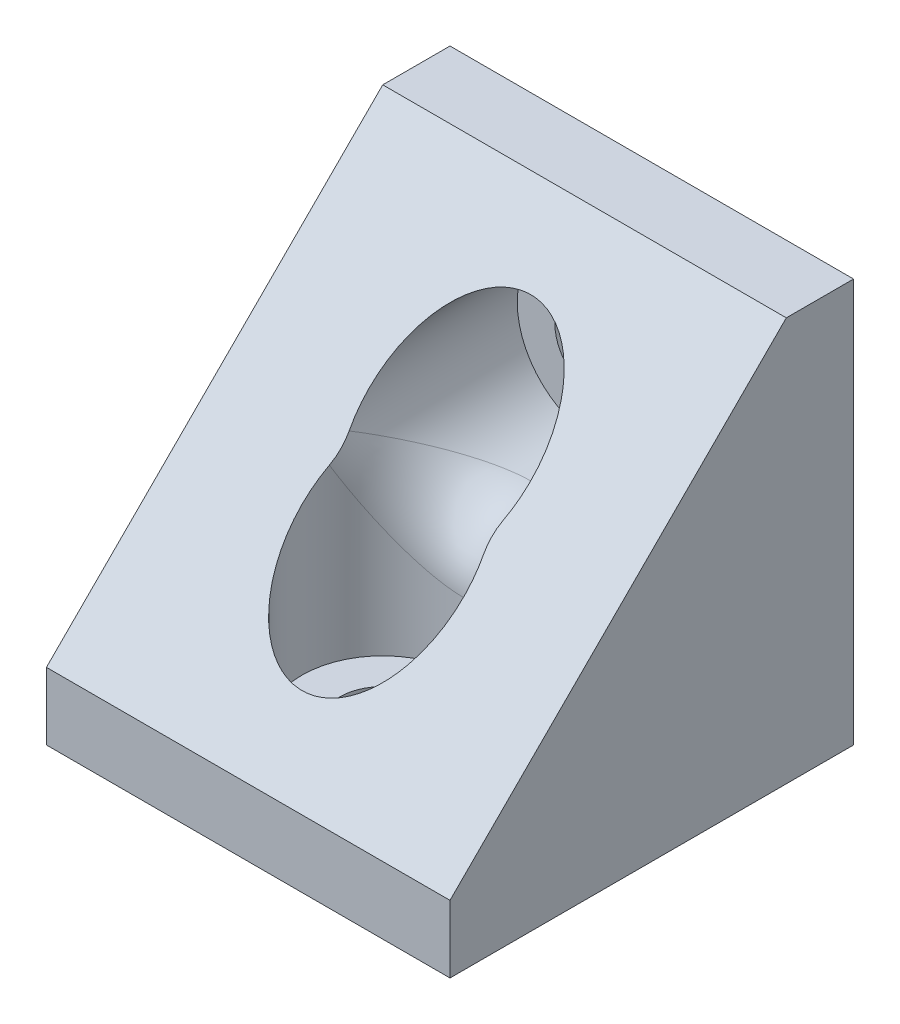
ISO-10303-21;
HEADER;
FILE_DESCRIPTION(('STEP AP214'),'2;1');
FILE_NAME('part.step','',(''),(''),'','','');
FILE_SCHEMA(('AUTOMOTIVE_DESIGN { 1 0 10303 214 1 1 1 1 }'));
ENDSEC;
DATA;
#1=APPLICATION_CONTEXT('core data for automotive mechanical design processes');
#2=APPLICATION_PROTOCOL_DEFINITION('international standard','automotive_design',2000,#1);
#3=PRODUCT_CONTEXT('',#1,'mechanical');
#4=PRODUCT('Part','Part','',(#3));
#5=PRODUCT_RELATED_PRODUCT_CATEGORY('part','',(#4));
#6=PRODUCT_DEFINITION_FORMATION('','',#4);
#7=PRODUCT_DEFINITION_CONTEXT('part definition',#1,'design');
#8=PRODUCT_DEFINITION('design','',#6,#7);
#9=PRODUCT_DEFINITION_SHAPE('','',#8);
#10=(LENGTH_UNIT() NAMED_UNIT(*) SI_UNIT(.MILLI.,.METRE.));
#11=(NAMED_UNIT(*) PLANE_ANGLE_UNIT() SI_UNIT($,.RADIAN.));
#12=(NAMED_UNIT(*) SI_UNIT($,.STERADIAN.) SOLID_ANGLE_UNIT());
#13=UNCERTAINTY_MEASURE_WITH_UNIT(LENGTH_MEASURE(1.E-05),#10,'distance_accuracy_value','');
#14=(GEOMETRIC_REPRESENTATION_CONTEXT(3) GLOBAL_UNCERTAINTY_ASSIGNED_CONTEXT((#13)) GLOBAL_UNIT_ASSIGNED_CONTEXT((#10,
#11,#12)) REPRESENTATION_CONTEXT('',''));
#15=CARTESIAN_POINT('',(0.,0.,0.));
#16=DIRECTION('',(0.,0.,1.));
#17=DIRECTION('',(1.,0.,0.));
#18=AXIS2_PLACEMENT_3D('',#15,#16,#17);
#19=CARTESIAN_POINT('',(30.,30.,5.));
#20=DIRECTION('',(0.,-0.707106781186551,-0.707106781186544));
#21=DIRECTION('',(0.,0.707106781186544,-0.707106781186551));
#22=AXIS2_PLACEMENT_3D('',#19,#20,#21);
#23=PLANE('',#22);
#24=CARTESIAN_POINT('',(15.,15.0000000000003,19.9999999999998));
#25=DIRECTION('',(0.,0.707106781186551,0.707106781186544));
#26=DIRECTION('',(0.,-0.707106781186544,0.707106781186551));
#27=AXIS2_PLACEMENT_3D('',#24,#25,#26);
#28=ELLIPSE('',#27,8.48528137423861,6.);
#29=CARTESIAN_POINT('',(9.26538465555105,16.7647058823531,18.235294117647));
#30=VERTEX_POINT('',#29);
#31=CARTESIAN_POINT('',(20.7346153444489,16.7647058823531,18.235294117647));
#32=VERTEX_POINT('',#31);
#33=EDGE_CURVE('E235',#30,#32,#28,.T.);
#34=ORIENTED_EDGE('',*,*,#33,.F.);
#35=CARTESIAN_POINT('',(9.,20.,19.9999999999998));
#36=CARTESIAN_POINT('',(9.,20.,19.9999999999998));
#37=CARTESIAN_POINT('',(9.,20.,19.9999999999998));
#38=CARTESIAN_POINT('',(9.00000752853285,19.7603458974245,19.8692795804132));
#39=CARTESIAN_POINT('',(8.9999754753644,19.8148130985904,19.8148130985902));
#40=CARTESIAN_POINT('',(9.00000752853285,19.8692795804134,19.7603458974243));
#41=CARTESIAN_POINT('',(9.0042718387287,19.5207263616738,19.7385780154582));
#42=CARTESIAN_POINT('',(9.0078397715869,19.6295210965094,19.6295210965092));
#43=CARTESIAN_POINT('',(9.0042718387287,19.7385780154584,19.5207263616736));
#44=CARTESIAN_POINT('',(9.02136473344592,19.0419818103791,19.4774446238429));
#45=CARTESIAN_POINT('',(9.03916005140826,19.2602799073418,19.2602799073416));
#46=CARTESIAN_POINT('',(9.02136473344592,19.4774446238431,19.0419818103789));
#47=CARTESIAN_POINT('',(9.03419403239813,18.8028568377572,19.3470128205946));
#48=CARTESIAN_POINT('',(9.06266192213282,19.0760694895224,19.0760694895222));
#49=CARTESIAN_POINT('',(9.03419403239813,19.3470128205948,18.802856837757));
#50=CARTESIAN_POINT('',(9.08530255167739,18.0911259080916,18.9587959498679));
#51=CARTESIAN_POINT('',(9.1561561210999,18.5295256460378,18.5295256460376));
#52=CARTESIAN_POINT('',(9.08530255167739,18.9587959498681,18.0911259080914));
#53=CARTESIAN_POINT('',(9.13620208928388,17.6199263375209,18.701778002284));
#54=CARTESIAN_POINT('',(9.24943775726386,18.1700091496064,18.1700091496063));
#55=CARTESIAN_POINT('',(9.13620208928388,18.7017780022841,17.6199263375207));
#56=CARTESIAN_POINT('',(9.27154335930745,16.6938865636785,18.1966653983699));
#57=CARTESIAN_POINT('',(9.49349892693703,17.4768690772972,17.476869077297));
#58=CARTESIAN_POINT('',(9.27154335930745,18.1966653983701,16.6938865636783));
#59=CARTESIAN_POINT('',(9.35540817035112,16.2389045290022,17.9484933794556));
#60=CARTESIAN_POINT('',(9.64463442221609,17.1411713378073,17.1411713378071));
#61=CARTESIAN_POINT('',(9.35540817035112,17.9484933794558,16.238904529002));
#62=CARTESIAN_POINT('',(9.55554161490088,15.3531065701528,17.4653308564468));
#63=CARTESIAN_POINT('',(9.99728854867579,16.5070240739603,16.5070240739601));
#64=CARTESIAN_POINT('',(9.55554161490088,17.465330856447,15.3531065701526));
#65=CARTESIAN_POINT('',(9.67096110623925,14.9219714358722,17.2301662377483));
#66=CARTESIAN_POINT('',(10.1993364067397,16.2065668144458,16.2065668144456));
#67=CARTESIAN_POINT('',(9.67096110623925,17.2301662377485,14.9219714358721));
#68=CARTESIAN_POINT('',(9.93250426328793,14.0914599425131,16.7771599686433));
#69=CARTESIAN_POINT('',(10.6431462000127,15.6535562231557,15.6535562231555));
#70=CARTESIAN_POINT('',(9.93250426328793,16.7771599686435,14.0914599425129));
#71=CARTESIAN_POINT('',(10.0775336755101,13.6915095054249,16.5590051847771));
#72=CARTESIAN_POINT('',(10.8855894864916,15.399114121709,15.3991141217089));
#73=CARTESIAN_POINT('',(10.0775336755101,16.5590051847772,13.6915095054248));
#74=CARTESIAN_POINT('',(10.3960581325591,12.9304761854701,16.1438961011654));
#75=CARTESIAN_POINT('',(11.3952765699089,14.9471335327306,14.9471335327305));
#76=CARTESIAN_POINT('',(10.3960581325591,16.1438961011655,12.93047618547));
#77=CARTESIAN_POINT('',(10.5682623163386,12.5684939187966,15.9464512284345));
#78=CARTESIAN_POINT('',(11.6633027073068,14.7478961808847,14.7478961808845));
#79=CARTESIAN_POINT('',(10.5682623163386,15.9464512284346,12.5684939187964));
#80=CARTESIAN_POINT('',(10.9384003765285,11.8899257085608,15.5763231137602));
#81=CARTESIAN_POINT('',(12.2045250227463,14.412227015721,14.4122270157208));
#82=CARTESIAN_POINT('',(10.9384003765285,15.5763231137604,11.8899257085607));
#83=CARTESIAN_POINT('',(11.1349255731258,11.5720627617198,15.402943324574));
#84=CARTESIAN_POINT('',(12.4785118806446,14.2743630290576,14.2743630290575));
#85=CARTESIAN_POINT('',(11.1349255731258,15.4029433245741,11.5720627617196));
#86=CARTESIAN_POINT('',(11.550385554616,10.987600949809,15.0841459726232));
#87=CARTESIAN_POINT('',(13.007901779356,14.0618881651102,14.06188816511));
#88=CARTESIAN_POINT('',(11.550385554616,15.0841459726233,10.9876009498088));
#89=CARTESIAN_POINT('',(11.7679160269278,10.7193400513368,14.9378218461847));
#90=CARTESIAN_POINT('',(13.2639680979251,13.9861731477013,13.9861731477011));
#91=CARTESIAN_POINT('',(11.7679160269278,14.9378218461848,10.7193400513367));
#92=CARTESIAN_POINT('',(12.221834187391,10.2389486354842,14.6757901648084));
#93=CARTESIAN_POINT('',(13.7325365666842,13.890187216388,13.8901872163878));
#94=CARTESIAN_POINT('',(12.221834187391,14.6757901648085,10.238948635484));
#95=CARTESIAN_POINT('',(12.4569647764445,10.0248624037429,14.5590158565831));
#96=CARTESIAN_POINT('',(13.9454397062226,13.8691504952176,13.8691504952174));
#97=CARTESIAN_POINT('',(12.4569647764445,14.5590158565832,10.0248624037427));
#98=CARTESIAN_POINT('',(12.8226386169068,9.74714732275079,14.4075349033203));
#99=CARTESIAN_POINT('',(14.2182953361164,13.8654123996071,13.865412399607));
#100=CARTESIAN_POINT('',(12.8226386169068,14.4075349033204,9.74714732275064));
#101=CARTESIAN_POINT('',(12.9441071514476,9.66310814085734,14.3616953495636));
#102=CARTESIAN_POINT('',(14.3007771201009,13.8686489339747,13.8686489339746));
#103=CARTESIAN_POINT('',(12.9441071514476,14.3616953495637,9.66310814085719));
#104=CARTESIAN_POINT('',(13.1920288957753,9.50853431928578,14.2773823559782));
#105=CARTESIAN_POINT('',(14.4512156982057,13.881156363931,13.8811563639308));
#106=CARTESIAN_POINT('',(13.1920288957753,14.2773823559783,9.50853431928563));
#107=CARTESIAN_POINT('',(13.3184796608175,9.43799315334304,14.2389053563689));
#108=CARTESIAN_POINT('',(14.5188806436997,13.8904877294729,13.8904877294728));
#109=CARTESIAN_POINT('',(13.3184796608175,14.238905356369,9.43799315334289));
#110=CARTESIAN_POINT('',(13.5719049366675,9.31349894951488,14.1709994270079));
#111=CARTESIAN_POINT('',(14.6373358009317,13.9117685026329,13.9117685026327));
#112=CARTESIAN_POINT('',(13.5719049366675,14.170999427008,9.31349894951473));
#113=CARTESIAN_POINT('',(13.6987543885076,9.25911862858065,14.1413374337748));
#114=CARTESIAN_POINT('',(14.6883176176596,13.9236435596809,13.9236435596808));
#115=CARTESIAN_POINT('',(13.6987543885076,14.1413374337749,9.2591186285805));
#116=CARTESIAN_POINT('',(13.9556418837811,9.16525512671252,14.0901391600292));
#117=CARTESIAN_POINT('',(14.7772381709888,13.9470134699862,13.9470134699861));
#118=CARTESIAN_POINT('',(13.9556418837811,14.0901391600293,9.16525512671237));
#119=CARTESIAN_POINT('',(14.0856783519271,9.1257647380193,14.0685989480115));
#120=CARTESIAN_POINT('',(14.8149723647627,13.9584778167434,13.9584778167433));
#121=CARTESIAN_POINT('',(14.0856783519271,14.0685989480116,9.12576473801915));
#122=CARTESIAN_POINT('',(14.3458965753316,9.06295777190634,14.0343406028568));
#123=CARTESIAN_POINT('',(14.879898597683,13.9779960998507,13.9779960998506));
#124=CARTESIAN_POINT('',(14.3458965753316,14.0343406028569,9.06295777190619));
#125=CARTESIAN_POINT('',(14.4760423171523,9.03939114403074,14.0214860785621));
#126=CARTESIAN_POINT('',(14.9071142914436,13.986059689095,13.9860596890949));
#127=CARTESIAN_POINT('',(14.4760423171523,14.0214860785622,9.03939114403059));
#128=CARTESIAN_POINT('',(14.7374587193486,9.00791239729594,14.0043158530709));
#129=CARTESIAN_POINT('',(14.9562655706693,13.9970766274864,13.9970766274862));
#130=CARTESIAN_POINT('',(14.7374587193486,14.004315853071,9.0079123972958));
#131=CARTESIAN_POINT('',(14.8687293596743,9.00000000000006,13.9999999999999));
#132=CARTESIAN_POINT('',(14.9781170220427,14.,13.9999999999999));
#133=CARTESIAN_POINT('',(14.8687293596743,14.,8.99999999999991));
#134=CARTESIAN_POINT('',(15.1312706403257,9.00000000000006,13.9999999999999));
#135=CARTESIAN_POINT('',(15.0218829779573,14.,13.9999999999999));
#136=CARTESIAN_POINT('',(15.1312706403257,14.,8.99999999999991));
#137=CARTESIAN_POINT('',(15.2625412806514,9.00791239729594,14.0043158530709));
#138=CARTESIAN_POINT('',(15.0437344293307,13.9970766274864,13.9970766274862));
#139=CARTESIAN_POINT('',(15.2625412806514,14.004315853071,9.0079123972958));
#140=CARTESIAN_POINT('',(15.5239576828477,9.03939114403074,14.0214860785621));
#141=CARTESIAN_POINT('',(15.0928857085564,13.986059689095,13.9860596890949));
#142=CARTESIAN_POINT('',(15.5239576828477,14.0214860785622,9.03939114403059));
#143=CARTESIAN_POINT('',(15.6541034246684,9.06295777190634,14.0343406028568));
#144=CARTESIAN_POINT('',(15.120101402317,13.9779960998507,13.9779960998506));
#145=CARTESIAN_POINT('',(15.6541034246684,14.0343406028569,9.06295777190619));
#146=CARTESIAN_POINT('',(15.9143216480729,9.1257647380193,14.0685989480115));
#147=CARTESIAN_POINT('',(15.1850276352373,13.9584778167434,13.9584778167433));
#148=CARTESIAN_POINT('',(15.9143216480729,14.0685989480116,9.12576473801915));
#149=CARTESIAN_POINT('',(16.0443581162189,9.16525512671252,14.0901391600292));
#150=CARTESIAN_POINT('',(15.2227618290112,13.9470134699863,13.9470134699861));
#151=CARTESIAN_POINT('',(16.0443581162189,14.0901391600293,9.16525512671237));
#152=CARTESIAN_POINT('',(16.3012456114924,9.25911862858065,14.1413374337748));
#153=CARTESIAN_POINT('',(15.3116823823404,13.9236435596809,13.9236435596808));
#154=CARTESIAN_POINT('',(16.3012456114924,14.1413374337749,9.2591186285805));
#155=CARTESIAN_POINT('',(16.4280950633325,9.31349894951488,14.1709994270079));
#156=CARTESIAN_POINT('',(15.3626641990683,13.9117685026329,13.9117685026327));
#157=CARTESIAN_POINT('',(16.4280950633325,14.170999427008,9.31349894951473));
#158=CARTESIAN_POINT('',(16.6815203391825,9.43799315334304,14.2389053563689));
#159=CARTESIAN_POINT('',(15.4811193563003,13.8904877294729,13.8904877294728));
#160=CARTESIAN_POINT('',(16.6815203391825,14.238905356369,9.43799315334289));
#161=CARTESIAN_POINT('',(16.8079711042247,9.50853431928578,14.2773823559782));
#162=CARTESIAN_POINT('',(15.5487843017943,13.881156363931,13.8811563639308));
#163=CARTESIAN_POINT('',(16.8079711042247,14.2773823559783,9.50853431928563));
#164=CARTESIAN_POINT('',(17.0558928485524,9.66310814085734,14.3616953495636));
#165=CARTESIAN_POINT('',(15.6992228798991,13.8686489339747,13.8686489339746));
#166=CARTESIAN_POINT('',(17.0558928485524,14.3616953495637,9.66310814085719));
#167=CARTESIAN_POINT('',(17.1773613830932,9.74714732275079,14.4075349033203));
#168=CARTESIAN_POINT('',(15.7817046638836,13.8654123996071,13.865412399607));
#169=CARTESIAN_POINT('',(17.1773613830932,14.4075349033204,9.74714732275064));
#170=CARTESIAN_POINT('',(17.5430352235555,10.0248624037429,14.5590158565831));
#171=CARTESIAN_POINT('',(16.0545602937774,13.8691504952176,13.8691504952174));
#172=CARTESIAN_POINT('',(17.5430352235555,14.5590158565832,10.0248624037427));
#173=CARTESIAN_POINT('',(17.778165812609,10.2389486354842,14.6757901648084));
#174=CARTESIAN_POINT('',(16.2674634333158,13.890187216388,13.8901872163878));
#175=CARTESIAN_POINT('',(17.778165812609,14.6757901648085,10.238948635484));
#176=CARTESIAN_POINT('',(18.2320839730722,10.7193400513368,14.9378218461847));
#177=CARTESIAN_POINT('',(16.7360319020749,13.9861731477013,13.9861731477011));
#178=CARTESIAN_POINT('',(18.2320839730722,14.9378218461848,10.7193400513367));
#179=CARTESIAN_POINT('',(18.449614445384,10.987600949809,15.0841459726232));
#180=CARTESIAN_POINT('',(16.992098220644,14.0618881651102,14.06188816511));
#181=CARTESIAN_POINT('',(18.449614445384,15.0841459726233,10.9876009498088));
#182=CARTESIAN_POINT('',(18.8650744268742,11.5720627617198,15.402943324574));
#183=CARTESIAN_POINT('',(17.5214881193554,14.2743630290576,14.2743630290575));
#184=CARTESIAN_POINT('',(18.8650744268742,15.4029433245741,11.5720627617196));
#185=CARTESIAN_POINT('',(19.0615996234715,11.8899257085608,15.5763231137602));
#186=CARTESIAN_POINT('',(17.7954749772537,14.412227015721,14.4122270157208));
#187=CARTESIAN_POINT('',(19.0615996234715,15.5763231137604,11.8899257085607));
#188=CARTESIAN_POINT('',(19.4317376836614,12.5684939187966,15.9464512284345));
#189=CARTESIAN_POINT('',(18.3366972926932,14.7478961808847,14.7478961808845));
#190=CARTESIAN_POINT('',(19.4317376836614,15.9464512284346,12.5684939187964));
#191=CARTESIAN_POINT('',(19.6039418674409,12.9304761854701,16.1438961011654));
#192=CARTESIAN_POINT('',(18.6047234300911,14.9471335327306,14.9471335327305));
#193=CARTESIAN_POINT('',(19.6039418674409,16.1438961011655,12.93047618547));
#194=CARTESIAN_POINT('',(19.9224663244899,13.6915095054249,16.5590051847771));
#195=CARTESIAN_POINT('',(19.1144105135084,15.399114121709,15.3991141217089));
#196=CARTESIAN_POINT('',(19.9224663244899,16.5590051847772,13.6915095054248));
#197=CARTESIAN_POINT('',(20.0674957367121,14.0914599425131,16.7771599686433));
#198=CARTESIAN_POINT('',(19.3568537999873,15.6535562231556,15.6535562231555));
#199=CARTESIAN_POINT('',(20.0674957367121,16.7771599686435,14.0914599425129));
#200=CARTESIAN_POINT('',(20.3290388937607,14.9219714358722,17.2301662377483));
#201=CARTESIAN_POINT('',(19.8006635932603,16.2065668144458,16.2065668144456));
#202=CARTESIAN_POINT('',(20.3290388937607,17.2301662377485,14.9219714358721));
#203=CARTESIAN_POINT('',(20.4444583850991,15.3531065701528,17.4653308564468));
#204=CARTESIAN_POINT('',(20.0027114513242,16.5070240739603,16.5070240739601));
#205=CARTESIAN_POINT('',(20.4444583850991,17.465330856447,15.3531065701526));
#206=CARTESIAN_POINT('',(20.6445918296489,16.2389045290022,17.9484933794556));
#207=CARTESIAN_POINT('',(20.3553655777839,17.1411713378073,17.1411713378071));
#208=CARTESIAN_POINT('',(20.6445918296489,17.9484933794558,16.238904529002));
#209=CARTESIAN_POINT('',(20.7284566406925,16.6938865636785,18.1966653983699));
#210=CARTESIAN_POINT('',(20.506501073063,17.4768690772972,17.476869077297));
#211=CARTESIAN_POINT('',(20.7284566406925,18.1966653983701,16.6938865636783));
#212=CARTESIAN_POINT('',(20.8637979107161,17.6199263375209,18.7017780022839));
#213=CARTESIAN_POINT('',(20.7505622427361,18.1700091496064,18.1700091496063));
#214=CARTESIAN_POINT('',(20.8637979107161,18.7017780022841,17.6199263375207));
#215=CARTESIAN_POINT('',(20.9146974483226,18.0911259080916,18.9587959498679));
#216=CARTESIAN_POINT('',(20.8438438789001,18.5295256460378,18.5295256460376));
#217=CARTESIAN_POINT('',(20.9146974483226,18.9587959498681,18.0911259080914));
#218=CARTESIAN_POINT('',(20.9658059676019,18.8028568377572,19.3470128205946));
#219=CARTESIAN_POINT('',(20.9373380778672,19.0760694895224,19.0760694895222));
#220=CARTESIAN_POINT('',(20.9658059676019,19.3470128205948,18.802856837757));
#221=CARTESIAN_POINT('',(20.9786352665541,19.0419818103791,19.4774446238429));
#222=CARTESIAN_POINT('',(20.9608399485917,19.2602799073418,19.2602799073416));
#223=CARTESIAN_POINT('',(20.9786352665541,19.4774446238431,19.0419818103789));
#224=CARTESIAN_POINT('',(20.9957281612713,19.5207263616738,19.7385780154582));
#225=CARTESIAN_POINT('',(20.9921602284131,19.6295210965094,19.6295210965092));
#226=CARTESIAN_POINT('',(20.9957281612713,19.7385780154584,19.5207263616736));
#227=CARTESIAN_POINT('',(20.9999924714671,19.7603458974245,19.8692795804131));
#228=CARTESIAN_POINT('',(21.0000245246356,19.8148130985904,19.8148130985902));
#229=CARTESIAN_POINT('',(20.9999924714671,19.8692795804134,19.7603458974243));
#230=CARTESIAN_POINT('',(21.,20.,19.9999999999998));
#231=CARTESIAN_POINT('',(21.,20.,19.9999999999998));
#232=CARTESIAN_POINT('',(21.,20.,19.9999999999998));
#233=(BOUNDED_SURFACE() B_SPLINE_SURFACE(3,2,((#35,#36,#37),(#38,#39,#40),(#41,#42,#43),(#44,
#45,#46),(#47,#48,#49),(#50,#51,#52),(#53,#54,#55),(#56,#57,#58),(#59,#60,#61),(#62,#63,#64),
(#65,#66,#67),(#68,#69,#70),(#71,#72,#73),(#74,#75,#76),(#77,#78,#79),(#80,#81,#82),(#83,#84,
#85),(#86,#87,#88),(#89,#90,#91),(#92,#93,#94),(#95,#96,#97),(#98,#99,#100),(#101,#102,#103),
(#104,#105,#106),(#107,#108,#109),(#110,#111,#112),(#113,#114,#115),(#116,#117,#118),(#119,#120,
#121),(#122,#123,#124),(#125,#126,#127),(#128,#129,#130),(#131,#132,#133),(#134,#135,#136),
(#137,#138,#139),(#140,#141,#142),(#143,#144,#145),(#146,#147,#148),(#149,#150,#151),(#152,#153,
#154),(#155,#156,#157),(#158,#159,#160),(#161,#162,#163),(#164,#165,#166),(#167,#168,#169),
(#170,#171,#172),(#173,#174,#175),(#176,#177,#178),(#179,#180,#181),(#182,#183,#184),(#185,#186,
#187),(#188,#189,#190),(#191,#192,#193),(#194,#195,#196),(#197,#198,#199),(#200,#201,#202),
(#203,#204,#205),(#206,#207,#208),(#209,#210,#211),(#212,#213,#214),(#215,#216,#217),(#218,#219,
#220),(#221,#222,#223),(#224,#225,#226),(#227,#228,#229),(#230,#231,#232)),.UNSPECIFIED.,.F.,
.F.,.F.) B_SPLINE_SURFACE_WITH_KNOTS((4,2,2,2,2,2,2,2,2,2,2,2,2,2,2,2,2,2,2,2,2,2,2,2,2,2,2,2,2,
2,2,2,4),(3,3),(0.,1.01657632639328,2.03323745899664,4.04865040321559,6.03025891798372,
7.96305170811304,9.83432357739877,11.6344992219486,13.3579835680867,15.0040006499645,
16.5773228270909,17.3338592213356,18.0900289022861,18.8239328400925,19.5574810600314,
20.279224647026,21.0009553964872,21.7226861459485,22.4444297329431,23.177977952882,
23.9118818906883,24.6680515716389,25.4245879658835,26.9979101430099,28.6439272248877,
30.3674115710258,32.1675872155757,34.0388590848614,35.9716518749907,37.9532603897589,
39.9686733339778,40.9853344665812,42.0019107929745),(0.,1.),
.UNSPECIFIED.) GEOMETRIC_REPRESENTATION_ITEM() RATIONAL_B_SPLINE_SURFACE(((1.,1.,1.),(1.,
0.999999961347463,1.),(1.,0.999643922983415,1.),(1.,0.998220838244432,1.),(1.,0.9971537325573,
1.),(1.,0.992912442828984,1.),(1.,0.988698139291651,1.),(1.,0.97761667849139,1.),(1.,
0.970795203041526,1.),(1.,0.954789243872562,1.),(1.,0.945667111065176,1.),(1.,0.925487928481902,
1.),(1.,0.914501709356373,1.),(1.,0.891170043426545,1.),(1.,0.878892097179546,1.),(1.,
0.853706858802365,1.),(1.,0.840848661884108,1.),(1.,0.815387916749465,1.),(1.,0.802799855389337,
1.),(1.,0.778879121395581,1.),(1.,0.767515558252509,1.),(1.,0.752114039788178,1.),(1.,
0.747335652878589,1.),(1.,0.738380806528768,1.),(1.,0.734204056441027,1.),(1.,0.726720755902303,
1.),(1.,0.723392203429009,1.),(1.,0.717584783984876,1.),(1.,0.715105505959659,1.),(1.,
0.711136412340241,1.),(1.,0.709631315866732,1.),(1.,0.707616509142034,1.),(1.,0.707106781186551,
1.),(1.,0.707106781186551,1.),(1.,0.707616509142034,1.),(1.,0.709631315866732,1.),(1.,
0.711136412340241,1.),(1.,0.715105505959659,1.),(1.,0.717584783984876,1.),(1.,0.723392203429009,
1.),(1.,0.726720755902303,1.),(1.,0.734204056441027,1.),(1.,0.738380806528768,1.),(1.,
0.747335652878589,1.),(1.,0.752114039788179,1.),(1.,0.76751555825251,1.),(1.,0.778879121395581,
1.),(1.,0.802799855389337,1.),(1.,0.815387916749465,1.),(1.,0.840848661884109,1.),(1.,
0.853706858802365,1.),(1.,0.878892097179546,1.),(1.,0.891170043426545,1.),(1.,0.914501709356372,
1.),(1.,0.925487928481902,1.),(1.,0.945667111065175,1.),(1.,0.954789243872562,1.),(1.,
0.970795203041526,1.),(1.,0.97761667849139,1.),(1.,0.988698139291651,1.),(1.,0.992912442828984,
1.),(1.,0.9971537325573,1.),(1.,0.998220838244432,1.),(1.,0.999643922983415,1.),(1.,
0.999999961347463,1.),(1.,1.,1.))) REPRESENTATION_ITEM('') SURFACE());
#234=CARTESIAN_POINT('',(9.26538465555105,16.7647058823531,18.235294117647));
#235=CARTESIAN_POINT('',(9.2948901609987,16.8605463931236,18.1394536068765));
#236=CARTESIAN_POINT('',(9.31861407894256,16.9572788774362,18.0427211225639));
#237=CARTESIAN_POINT('',(9.3543730986089,17.1518365709526,17.8481634290475));
#238=CARTESIAN_POINT('',(9.36640601121333,17.2496619813372,17.7503380186629));
#239=CARTESIAN_POINT('',(9.37853802304383,17.4439449832289,17.5560550167712));
#240=CARTESIAN_POINT('',(9.37884436545352,17.5403961766117,17.4596038233885));
#241=CARTESIAN_POINT('',(9.368061774075,17.7329601304633,17.2670398695368));
#242=CARTESIAN_POINT('',(9.35697648854989,17.829072989398,17.1709270106022));
#243=CARTESIAN_POINT('',(9.33109589938466,17.9768198366746,17.0231801633255));
#244=CARTESIAN_POINT('',(9.32027620238365,18.0288169286711,16.971183071329));
#245=CARTESIAN_POINT('',(9.29531274658572,18.1323896231641,16.867610376836));
#246=CARTESIAN_POINT('',(9.2811702986511,18.1839653835987,16.8160346164014));
#247=CARTESIAN_POINT('',(9.26538465555105,18.2352941176472,16.764705882353));
#248=B_SPLINE_CURVE_WITH_KNOTS('',3,(#234,#235,#236,#237,#238,#239,#240,#241,#242,#243,#244,
#245,#246,#247),.UNSPECIFIED.,.F.,.F.,(4,2,2,2,2,2,4),(0.,0.416021473667783,0.832120831544366,
1.24086302345128,1.64947435307223,1.87238626166583,2.09521037625455),.UNSPECIFIED.);
#249=CARTESIAN_POINT('',(9.26538465555105,18.2352941176472,16.764705882353));
#250=VERTEX_POINT('',#249);
#251=EDGE_CURVE('E55',#30,#250,#248,.T.);
#252=ORIENTED_EDGE('',*,*,#251,.T.);
#253=CARTESIAN_POINT('',(15.,20.,15.0000000000001));
#254=DIRECTION('',(0.,-0.707106781186551,-0.707106781186544));
#255=DIRECTION('',(0.,0.707106781186544,-0.707106781186551));
#256=AXIS2_PLACEMENT_3D('',#253,#254,#255);
#257=ELLIPSE('',#256,8.48528137423861,6.);
#258=CARTESIAN_POINT('',(20.7346153444489,18.2352941176472,16.764705882353));
#259=VERTEX_POINT('',#258);
#260=EDGE_CURVE('E143',#250,#259,#257,.T.);
#261=ORIENTED_EDGE('',*,*,#260,.T.);
#262=CARTESIAN_POINT('',(20.7346153444489,18.2352941176472,16.764705882353));
#263=CARTESIAN_POINT('',(20.7051098389983,18.1394536068768,16.8605463931233));
#264=CARTESIAN_POINT('',(20.6813859210559,18.0427211225642,16.9572788774359));
#265=CARTESIAN_POINT('',(20.6456269013936,17.8481634290477,17.1518365709524));
#266=CARTESIAN_POINT('',(20.6335939887919,17.7503380186629,17.2496619813372));
#267=CARTESIAN_POINT('',(20.6214619769607,17.5560550167711,17.4439449832291));
#268=CARTESIAN_POINT('',(20.6211556345476,17.4596038233884,17.5403961766118));
#269=CARTESIAN_POINT('',(20.6319382259238,17.2670398695369,17.7329601304633));
#270=CARTESIAN_POINT('',(20.6430235114498,17.1709270106023,17.8290729893979));
#271=CARTESIAN_POINT('',(20.6689041006155,17.0231801633257,17.9768198366744));
#272=CARTESIAN_POINT('',(20.6797237976165,16.9711830713292,18.0288169286709));
#273=CARTESIAN_POINT('',(20.7046872534144,16.8676103768363,18.1323896231638));
#274=CARTESIAN_POINT('',(20.7188297013489,16.8160346164016,18.1839653835985));
#275=CARTESIAN_POINT('',(20.7346153444489,16.7647058823531,18.235294117647));
#276=B_SPLINE_CURVE_WITH_KNOTS('',3,(#262,#263,#264,#265,#266,#267,#268,#269,#270,#271,#272,
#273,#274,#275),.UNSPECIFIED.,.F.,.F.,(4,2,2,2,2,2,4),(0.,0.416021473667478,0.832120831544337,
1.24086302345118,1.64947435307178,1.87238626166528,2.09521037625409),.UNSPECIFIED.);
#277=EDGE_CURVE('E168',#259,#32,#276,.T.);
#278=ORIENTED_EDGE('',*,*,#277,.T.);
#279=EDGE_LOOP('',(#34,#252,#261,#278));
#280=FACE_BOUND('',#279,.T.);
#281=DIRECTION('',(0.,-0.707106781186544,0.707106781186551));
#282=VECTOR('',#281,1.);
#283=CARTESIAN_POINT('',(0.,30.,5.));
#284=LINE('',#283,#282);
#285=CARTESIAN_POINT('',(0.,30.,5.));
#286=VERTEX_POINT('',#285);
#287=CARTESIAN_POINT('',(0.,5.00000000000031,30.));
#288=VERTEX_POINT('',#287);
#289=EDGE_CURVE('E148',#286,#288,#284,.T.);
#290=ORIENTED_EDGE('',*,*,#289,.T.);
#291=DIRECTION('',(-1.,0.,0.));
#292=VECTOR('',#291,1.);
#293=CARTESIAN_POINT('',(30.,5.00000000000031,30.));
#294=LINE('',#293,#292);
#295=CARTESIAN_POINT('',(30.,5.00000000000031,30.));
#296=VERTEX_POINT('',#295);
#297=EDGE_CURVE('E114',#296,#288,#294,.T.);
#298=ORIENTED_EDGE('',*,*,#297,.F.);
#299=DIRECTION('',(0.,-0.707106781186544,0.707106781186551));
#300=VECTOR('',#299,1.);
#301=CARTESIAN_POINT('',(30.,30.,5.));
#302=LINE('',#301,#300);
#303=CARTESIAN_POINT('',(30.,30.,5.));
#304=VERTEX_POINT('',#303);
#305=EDGE_CURVE('E110',#304,#296,#302,.T.);
#306=ORIENTED_EDGE('',*,*,#305,.F.);
#307=DIRECTION('',(-1.,0.,0.));
#308=VECTOR('',#307,1.);
#309=CARTESIAN_POINT('',(30.,30.,5.));
#310=LINE('',#309,#308);
#311=EDGE_CURVE('E155',#304,#286,#310,.T.);
#312=ORIENTED_EDGE('',*,*,#311,.T.);
#313=EDGE_LOOP('',(#290,#298,#306,#312));
#314=FACE_BOUND('',#313,.T.);
#315=ADVANCED_FACE('F41',(#280,#314),#23,.F.);
#316=CARTESIAN_POINT('',(30.,0.,0.));
#317=DIRECTION('',(0.,0.,1.));
#318=DIRECTION('',(1.,0.,0.));
#319=AXIS2_PLACEMENT_3D('',#316,#317,#318);
#320=PLANE('',#319);
#321=CARTESIAN_POINT('',(15.,20.,0.));
#322=DIRECTION('',(0.,0.,-1.));
#323=DIRECTION('',(-1.,0.,0.));
#324=AXIS2_PLACEMENT_3D('',#321,#322,#323);
#325=CIRCLE('',#324,3.2);
#326=CARTESIAN_POINT('',(11.8,20.,0.));
#327=VERTEX_POINT('',#326);
#328=EDGE_CURVE('E145',#327,#327,#325,.T.);
#329=ORIENTED_EDGE('',*,*,#328,.F.);
#330=EDGE_LOOP('',(#329));
#331=FACE_BOUND('',#330,.T.);
#332=DIRECTION('',(0.,1.,0.));
#333=VECTOR('',#332,1.);
#334=CARTESIAN_POINT('',(0.,0.,0.));
#335=LINE('',#334,#333);
#336=CARTESIAN_POINT('',(0.,0.,0.));
#337=VERTEX_POINT('',#336);
#338=CARTESIAN_POINT('',(0.,30.,0.));
#339=VERTEX_POINT('',#338);
#340=EDGE_CURVE('E157',#337,#339,#335,.T.);
#341=ORIENTED_EDGE('',*,*,#340,.T.);
#342=DIRECTION('',(-1.,0.,0.));
#343=VECTOR('',#342,1.);
#344=CARTESIAN_POINT('',(30.,30.,0.));
#345=LINE('',#344,#343);
#346=CARTESIAN_POINT('',(30.,30.,0.));
#347=VERTEX_POINT('',#346);
#348=EDGE_CURVE('E162',#347,#339,#345,.T.);
#349=ORIENTED_EDGE('',*,*,#348,.F.);
#350=DIRECTION('',(0.,1.,0.));
#351=VECTOR('',#350,1.);
#352=CARTESIAN_POINT('',(30.,0.,0.));
#353=LINE('',#352,#351);
#354=CARTESIAN_POINT('',(30.,0.,0.));
#355=VERTEX_POINT('',#354);
#356=EDGE_CURVE('E150',#355,#347,#353,.T.);
#357=ORIENTED_EDGE('',*,*,#356,.F.);
#358=DIRECTION('',(-1.,0.,0.));
#359=VECTOR('',#358,1.);
#360=CARTESIAN_POINT('',(30.,0.,0.));
#361=LINE('',#360,#359);
#362=EDGE_CURVE('E123',#355,#337,#361,.T.);
#363=ORIENTED_EDGE('',*,*,#362,.T.);
#364=EDGE_LOOP('',(#341,#349,#357,#363));
#365=FACE_BOUND('',#364,.T.);
#366=ADVANCED_FACE('F181',(#331,#365),#320,.F.);
#367=CARTESIAN_POINT('',(30.,30.,0.));
#368=DIRECTION('',(0.,-1.,0.));
#369=DIRECTION('',(0.,0.,-1.));
#370=AXIS2_PLACEMENT_3D('',#367,#368,#369);
#371=PLANE('',#370);
#372=DIRECTION('',(0.,0.,1.));
#373=VECTOR('',#372,1.);
#374=CARTESIAN_POINT('',(0.,30.,0.));
#375=LINE('',#374,#373);
#376=EDGE_CURVE('E151',#339,#286,#375,.T.);
#377=ORIENTED_EDGE('',*,*,#376,.T.);
#378=ORIENTED_EDGE('',*,*,#311,.F.);
#379=DIRECTION('',(0.,0.,1.));
#380=VECTOR('',#379,1.);
#381=CARTESIAN_POINT('',(30.,30.,0.));
#382=LINE('',#381,#380);
#383=EDGE_CURVE('E153',#347,#304,#382,.T.);
#384=ORIENTED_EDGE('',*,*,#383,.F.);
#385=ORIENTED_EDGE('',*,*,#348,.T.);
#386=EDGE_LOOP('',(#377,#378,#384,#385));
#387=FACE_BOUND('',#386,.T.);
#388=ADVANCED_FACE('F185',(#387),#371,.F.);
#389=CARTESIAN_POINT('',(30.,0.,0.));
#390=DIRECTION('',(1.,0.,0.));
#391=DIRECTION('',(0.,0.,-1.));
#392=AXIS2_PLACEMENT_3D('',#389,#390,#391);
#393=PLANE('',#392);
#394=ORIENTED_EDGE('',*,*,#305,.T.);
#395=DIRECTION('',(0.,1.,0.));
#396=VECTOR('',#395,1.);
#397=CARTESIAN_POINT('',(30.,3.06421554796543E-13,30.));
#398=LINE('',#397,#396);
#399=CARTESIAN_POINT('',(30.,3.06421554796543E-13,30.));
#400=VERTEX_POINT('',#399);
#401=EDGE_CURVE('E103',#400,#296,#398,.T.);
#402=ORIENTED_EDGE('',*,*,#401,.F.);
#403=DIRECTION('',(0.,0.,1.));
#404=VECTOR('',#403,1.);
#405=CARTESIAN_POINT('',(30.,0.,0.));
#406=LINE('',#405,#404);
#407=EDGE_CURVE('E107',#355,#400,#406,.T.);
#408=ORIENTED_EDGE('',*,*,#407,.F.);
#409=ORIENTED_EDGE('',*,*,#356,.T.);
#410=ORIENTED_EDGE('',*,*,#383,.T.);
#411=EDGE_LOOP('',(#394,#402,#408,#409,#410));
#412=FACE_BOUND('',#411,.T.);
#413=ADVANCED_FACE('F105',(#412),#393,.T.);
#414=CARTESIAN_POINT('',(0.,0.,0.));
#415=DIRECTION('',(1.,0.,0.));
#416=DIRECTION('',(0.,0.,-1.));
#417=AXIS2_PLACEMENT_3D('',#414,#415,#416);
#418=PLANE('',#417);
#419=ORIENTED_EDGE('',*,*,#289,.F.);
#420=ORIENTED_EDGE('',*,*,#376,.F.);
#421=ORIENTED_EDGE('',*,*,#340,.F.);
#422=DIRECTION('',(0.,0.,1.));
#423=VECTOR('',#422,1.);
#424=CARTESIAN_POINT('',(0.,0.,0.));
#425=LINE('',#424,#423);
#426=CARTESIAN_POINT('',(0.,3.06421554796543E-13,30.));
#427=VERTEX_POINT('',#426);
#428=EDGE_CURVE('E128',#337,#427,#425,.T.);
#429=ORIENTED_EDGE('',*,*,#428,.T.);
#430=DIRECTION('',(0.,1.,0.));
#431=VECTOR('',#430,1.);
#432=CARTESIAN_POINT('',(0.,3.06421554796543E-13,30.));
#433=LINE('',#432,#431);
#434=EDGE_CURVE('E120',#427,#288,#433,.T.);
#435=ORIENTED_EDGE('',*,*,#434,.T.);
#436=EDGE_LOOP('',(#419,#420,#421,#429,#435));
#437=FACE_BOUND('',#436,.T.);
#438=ADVANCED_FACE('F190',(#437),#418,.F.);
#439=CARTESIAN_POINT('',(15.,20.,17.5));
#440=DIRECTION('',(0.,0.,-1.));
#441=DIRECTION('',(-1.,0.,0.));
#442=AXIS2_PLACEMENT_3D('',#439,#440,#441);
#443=CYLINDRICAL_SURFACE('',#442,3.2);
#444=CARTESIAN_POINT('',(15.,20.,4.));
#445=DIRECTION('',(0.,0.,-1.));
#446=DIRECTION('',(-1.,0.,0.));
#447=AXIS2_PLACEMENT_3D('',#444,#445,#446);
#448=CIRCLE('',#447,3.2);
#449=CARTESIAN_POINT('',(11.8,20.,4.));
#450=VERTEX_POINT('',#449);
#451=EDGE_CURVE('E140',#450,#450,#448,.T.);
#452=ORIENTED_EDGE('',*,*,#451,.F.);
#453=EDGE_LOOP('',(#452));
#454=FACE_BOUND('',#453,.T.);
#455=ORIENTED_EDGE('',*,*,#328,.T.);
#456=EDGE_LOOP('',(#455));
#457=FACE_BOUND('',#456,.T.);
#458=ADVANCED_FACE('F193',(#454,#457),#443,.F.);
#459=CARTESIAN_POINT('',(15.,20.,17.5));
#460=DIRECTION('',(0.,0.,-1.));
#461=DIRECTION('',(-1.,0.,0.));
#462=AXIS2_PLACEMENT_3D('',#459,#460,#461);
#463=CYLINDRICAL_SURFACE('',#462,6.);
#464=CARTESIAN_POINT('',(15.,20.,4.));
#465=DIRECTION('',(0.,0.,-1.));
#466=DIRECTION('',(-1.,0.,0.));
#467=AXIS2_PLACEMENT_3D('',#464,#465,#466);
#468=CIRCLE('',#467,6.);
#469=CARTESIAN_POINT('',(9.,20.,4.));
#470=VERTEX_POINT('',#469);
#471=EDGE_CURVE('E137',#470,#470,#468,.T.);
#472=ORIENTED_EDGE('',*,*,#471,.T.);
#473=EDGE_LOOP('',(#472));
#474=FACE_BOUND('',#473,.T.);
#475=ORIENTED_EDGE('',*,*,#260,.F.);
#476=CARTESIAN_POINT('',(15.,20.,19.9999999999998));
#477=DIRECTION('',(0.,0.877895572914382,-0.478852130680577));
#478=DIRECTION('',(0.,-0.478852130680577,-0.877895572914382));
#479=AXIS2_PLACEMENT_3D('',#476,#477,#478);
#480=ELLIPSE('',#479,12.5299640861416,6.);
#481=EDGE_CURVE('E11',#250,#259,#480,.F.);
#482=ORIENTED_EDGE('',*,*,#481,.T.);
#483=EDGE_LOOP('',(#475,#482));
#484=FACE_BOUND('',#483,.T.);
#485=ADVANCED_FACE('F198',(#474,#484),#463,.F.);
#486=CARTESIAN_POINT('',(0.,0.,4.));
#487=DIRECTION('',(0.,0.,-1.));
#488=DIRECTION('',(-1.,0.,0.));
#489=AXIS2_PLACEMENT_3D('',#486,#487,#488);
#490=PLANE('',#489);
#491=ORIENTED_EDGE('',*,*,#471,.F.);
#492=EDGE_LOOP('',(#491));
#493=FACE_BOUND('',#492,.T.);
#494=ORIENTED_EDGE('',*,*,#451,.T.);
#495=EDGE_LOOP('',(#494));
#496=FACE_BOUND('',#495,.T.);
#497=ADVANCED_FACE('F203',(#493,#496),#490,.F.);
#498=CARTESIAN_POINT('',(30.,0.,0.));
#499=DIRECTION('',(0.,1.,0.));
#500=DIRECTION('',(1.,0.,0.));
#501=AXIS2_PLACEMENT_3D('',#498,#499,#500);
#502=PLANE('',#501);
#503=CARTESIAN_POINT('',(15.,2.04281036531029E-13,20.));
#504=DIRECTION('',(0.,1.,0.));
#505=DIRECTION('',(-1.,0.,0.));
#506=AXIS2_PLACEMENT_3D('',#503,#504,#505);
#507=CIRCLE('',#506,3.2);
#508=CARTESIAN_POINT('',(11.8,2.04281036531029E-13,20.));
#509=VERTEX_POINT('',#508);
#510=EDGE_CURVE('E131',#509,#509,#507,.T.);
#511=ORIENTED_EDGE('',*,*,#510,.T.);
#512=EDGE_LOOP('',(#511));
#513=FACE_BOUND('',#512,.T.);
#514=ORIENTED_EDGE('',*,*,#428,.F.);
#515=ORIENTED_EDGE('',*,*,#362,.F.);
#516=ORIENTED_EDGE('',*,*,#407,.T.);
#517=DIRECTION('',(-1.,0.,0.));
#518=VECTOR('',#517,1.);
#519=CARTESIAN_POINT('',(30.,3.06421554796543E-13,30.));
#520=LINE('',#519,#518);
#521=EDGE_CURVE('E117',#400,#427,#520,.T.);
#522=ORIENTED_EDGE('',*,*,#521,.T.);
#523=EDGE_LOOP('',(#514,#515,#516,#522));
#524=FACE_BOUND('',#523,.T.);
#525=ADVANCED_FACE('F125',(#513,#524),#502,.F.);
#526=CARTESIAN_POINT('',(30.,3.06421554796543E-13,30.));
#527=DIRECTION('',(0.,0.,-1.));
#528=DIRECTION('',(0.,-1.,0.));
#529=AXIS2_PLACEMENT_3D('',#526,#527,#528);
#530=PLANE('',#529);
#531=ORIENTED_EDGE('',*,*,#434,.F.);
#532=ORIENTED_EDGE('',*,*,#521,.F.);
#533=ORIENTED_EDGE('',*,*,#401,.T.);
#534=ORIENTED_EDGE('',*,*,#297,.T.);
#535=EDGE_LOOP('',(#531,#532,#533,#534));
#536=FACE_BOUND('',#535,.T.);
#537=ADVANCED_FACE('F118',(#536),#530,.F.);
#538=CARTESIAN_POINT('',(15.,17.5000000000002,19.9999999999998));
#539=DIRECTION('',(0.,-1.,0.));
#540=DIRECTION('',(-1.,0.,0.));
#541=AXIS2_PLACEMENT_3D('',#538,#539,#540);
#542=CYLINDRICAL_SURFACE('',#541,3.2);
#543=CARTESIAN_POINT('',(15.,4.00000000000021,20.));
#544=DIRECTION('',(0.,1.,0.));
#545=DIRECTION('',(-1.,0.,0.));
#546=AXIS2_PLACEMENT_3D('',#543,#544,#545);
#547=CIRCLE('',#546,3.2);
#548=CARTESIAN_POINT('',(11.8,4.00000000000021,20.));
#549=VERTEX_POINT('',#548);
#550=EDGE_CURVE('E234',#549,#549,#547,.T.);
#551=ORIENTED_EDGE('',*,*,#550,.T.);
#552=EDGE_LOOP('',(#551));
#553=FACE_BOUND('',#552,.T.);
#554=ORIENTED_EDGE('',*,*,#510,.F.);
#555=EDGE_LOOP('',(#554));
#556=FACE_BOUND('',#555,.T.);
#557=ADVANCED_FACE('F213',(#553,#556),#542,.F.);
#558=CARTESIAN_POINT('',(15.,17.5000000000002,19.9999999999998));
#559=DIRECTION('',(0.,-1.,0.));
#560=DIRECTION('',(-1.,0.,0.));
#561=AXIS2_PLACEMENT_3D('',#558,#559,#560);
#562=CYLINDRICAL_SURFACE('',#561,6.);
#563=CARTESIAN_POINT('',(15.,4.00000000000021,20.));
#564=DIRECTION('',(0.,1.,0.));
#565=DIRECTION('',(-1.,0.,0.));
#566=AXIS2_PLACEMENT_3D('',#563,#564,#565);
#567=CIRCLE('',#566,6.);
#568=CARTESIAN_POINT('',(9.,4.00000000000021,20.));
#569=VERTEX_POINT('',#568);
#570=EDGE_CURVE('E231',#569,#569,#567,.T.);
#571=ORIENTED_EDGE('',*,*,#570,.F.);
#572=EDGE_LOOP('',(#571));
#573=FACE_BOUND('',#572,.T.);
#574=ORIENTED_EDGE('',*,*,#33,.T.);
#575=CARTESIAN_POINT('',(15.,20.,19.9999999999998));
#576=DIRECTION('',(0.,0.478852130680568,-0.877895572914387));
#577=DIRECTION('',(0.,-0.877895572914387,-0.478852130680568));
#578=AXIS2_PLACEMENT_3D('',#575,#576,#577);
#579=ELLIPSE('',#578,12.5299640861416,6.);
#580=EDGE_CURVE('E165',#32,#30,#579,.T.);
#581=ORIENTED_EDGE('',*,*,#580,.T.);
#582=EDGE_LOOP('',(#574,#581));
#583=FACE_BOUND('',#582,.T.);
#584=ADVANCED_FACE('F215',(#573,#583),#562,.F.);
#585=CARTESIAN_POINT('',(0.,4.,0.));
#586=DIRECTION('',(0.,-1.,0.));
#587=DIRECTION('',(-1.,0.,0.));
#588=AXIS2_PLACEMENT_3D('',#585,#586,#587);
#589=PLANE('',#588);
#590=ORIENTED_EDGE('',*,*,#570,.T.);
#591=EDGE_LOOP('',(#590));
#592=FACE_BOUND('',#591,.T.);
#593=ORIENTED_EDGE('',*,*,#550,.F.);
#594=EDGE_LOOP('',(#593));
#595=FACE_BOUND('',#594,.T.);
#596=ADVANCED_FACE('F220',(#592,#595),#589,.F.);
#597=ORIENTED_EDGE('',*,*,#277,.F.);
#598=ORIENTED_EDGE('',*,*,#481,.F.);
#599=ORIENTED_EDGE('',*,*,#251,.F.);
#600=ORIENTED_EDGE('',*,*,#580,.F.);
#601=EDGE_LOOP('',(#597,#598,#599,#600));
#602=FACE_BOUND('',#601,.T.);
#603=ADVANCED_FACE('F43',(#602),#233,.T.);
#604=CLOSED_SHELL('',(#315,#366,#388,#413,#438,#458,#485,#497,#525,#537,#557,#584,#596,#603));
#605=MANIFOLD_SOLID_BREP('B2',#604);
#606=ADVANCED_BREP_SHAPE_REPRESENTATION('',(#18,#605),#14);
#607=SHAPE_DEFINITION_REPRESENTATION(#9,#606);
ENDSEC;
END-ISO-10303-21;
